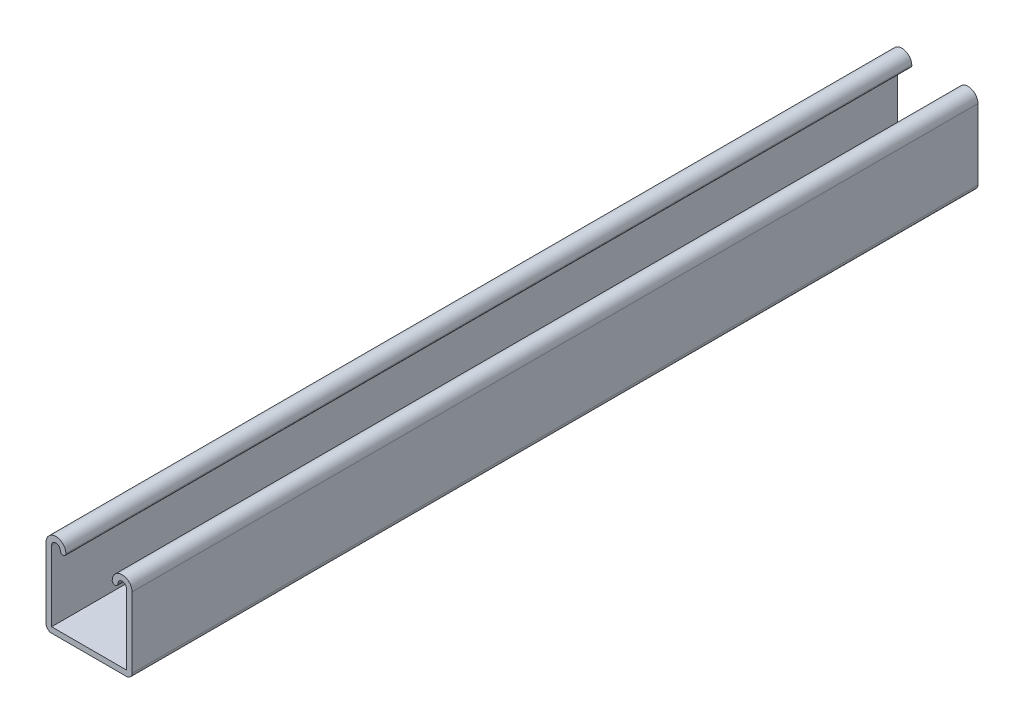
ISO-10303-21;
HEADER;
FILE_DESCRIPTION(('STEP AP214'),'2;1');
FILE_NAME('part.step','',(''),(''),'','','');
FILE_SCHEMA(('AUTOMOTIVE_DESIGN { 1 0 10303 214 1 1 1 1 }'));
ENDSEC;
DATA;
#1=APPLICATION_CONTEXT('core data for automotive mechanical design processes');
#2=APPLICATION_PROTOCOL_DEFINITION('international standard','automotive_design',2000,#1);
#3=PRODUCT_CONTEXT('',#1,'mechanical');
#4=PRODUCT('Part','Part','',(#3));
#5=PRODUCT_RELATED_PRODUCT_CATEGORY('part','',(#4));
#6=PRODUCT_DEFINITION_FORMATION('','',#4);
#7=PRODUCT_DEFINITION_CONTEXT('part definition',#1,'design');
#8=PRODUCT_DEFINITION('design','',#6,#7);
#9=PRODUCT_DEFINITION_SHAPE('','',#8);
#10=(LENGTH_UNIT() NAMED_UNIT(*) SI_UNIT(.MILLI.,.METRE.));
#11=(NAMED_UNIT(*) PLANE_ANGLE_UNIT() SI_UNIT($,.RADIAN.));
#12=(NAMED_UNIT(*) SI_UNIT($,.STERADIAN.) SOLID_ANGLE_UNIT());
#13=UNCERTAINTY_MEASURE_WITH_UNIT(LENGTH_MEASURE(1.E-05),#10,'distance_accuracy_value','');
#14=(GEOMETRIC_REPRESENTATION_CONTEXT(3) GLOBAL_UNCERTAINTY_ASSIGNED_CONTEXT((#13)) GLOBAL_UNIT_ASSIGNED_CONTEXT((#10,
#11,#12)) REPRESENTATION_CONTEXT('',''));
#15=CARTESIAN_POINT('',(0.,0.,0.));
#16=DIRECTION('',(0.,0.,1.));
#17=DIRECTION('',(1.,0.,0.));
#18=AXIS2_PLACEMENT_3D('',#15,#16,#17);
#19=CARTESIAN_POINT('',(0.,2.6924,406.4));
#20=DIRECTION('',(0.,0.,-1.));
#21=DIRECTION('',(-1.,0.,0.));
#22=AXIS2_PLACEMENT_3D('',#19,#20,#21);
#23=CYLINDRICAL_SURFACE('',#22,2.6924);
#24=CARTESIAN_POINT('',(0.,2.6924,0.));
#25=DIRECTION('',(0.,0.,1.));
#26=DIRECTION('',(-1.,0.,0.));
#27=AXIS2_PLACEMENT_3D('',#24,#25,#26);
#28=CIRCLE('',#27,2.6924);
#29=CARTESIAN_POINT('',(-2.6924,2.6924,0.));
#30=VERTEX_POINT('',#29);
#31=CARTESIAN_POINT('',(0.,0.,0.));
#32=VERTEX_POINT('',#31);
#33=EDGE_CURVE('E164',#30,#32,#28,.T.);
#34=ORIENTED_EDGE('',*,*,#33,.T.);
#35=DIRECTION('',(0.,0.,-1.));
#36=VECTOR('',#35,1.);
#37=CARTESIAN_POINT('',(0.,0.,406.4));
#38=LINE('',#37,#36);
#39=CARTESIAN_POINT('',(0.,0.,406.4));
#40=VERTEX_POINT('',#39);
#41=EDGE_CURVE('E11',#40,#32,#38,.T.);
#42=ORIENTED_EDGE('',*,*,#41,.F.);
#43=CARTESIAN_POINT('',(0.,2.6924,406.4));
#44=DIRECTION('',(0.,0.,1.));
#45=DIRECTION('',(-1.,0.,0.));
#46=AXIS2_PLACEMENT_3D('',#43,#44,#45);
#47=CIRCLE('',#46,2.6924);
#48=CARTESIAN_POINT('',(-2.6924,2.6924,406.4));
#49=VERTEX_POINT('',#48);
#50=EDGE_CURVE('E190',#49,#40,#47,.T.);
#51=ORIENTED_EDGE('',*,*,#50,.F.);
#52=DIRECTION('',(0.,0.,-1.));
#53=VECTOR('',#52,1.);
#54=CARTESIAN_POINT('',(-2.6924,2.6924,406.4));
#55=LINE('',#54,#53);
#56=EDGE_CURVE('E160',#49,#30,#55,.T.);
#57=ORIENTED_EDGE('',*,*,#56,.T.);
#58=EDGE_LOOP('',(#34,#42,#51,#57));
#59=FACE_BOUND('',#58,.T.);
#60=ADVANCED_FACE('F32',(#59),#23,.T.);
#61=CARTESIAN_POINT('',(0.,0.,406.4));
#62=DIRECTION('',(0.,1.,0.));
#63=DIRECTION('',(0.,0.,1.));
#64=AXIS2_PLACEMENT_3D('',#61,#62,#63);
#65=PLANE('',#64);
#66=DIRECTION('',(1.,0.,0.));
#67=VECTOR('',#66,1.);
#68=CARTESIAN_POINT('',(0.,0.,0.));
#69=LINE('',#68,#67);
#70=CARTESIAN_POINT('',(35.98,0.,0.));
#71=VERTEX_POINT('',#70);
#72=EDGE_CURVE('E167',#32,#71,#69,.T.);
#73=ORIENTED_EDGE('',*,*,#72,.T.);
#74=DIRECTION('',(0.,0.,-1.));
#75=VECTOR('',#74,1.);
#76=CARTESIAN_POINT('',(35.98,0.,406.4));
#77=LINE('',#76,#75);
#78=CARTESIAN_POINT('',(35.98,0.,406.4));
#79=VERTEX_POINT('',#78);
#80=EDGE_CURVE('E40',#79,#71,#77,.T.);
#81=ORIENTED_EDGE('',*,*,#80,.F.);
#82=DIRECTION('',(1.,0.,0.));
#83=VECTOR('',#82,1.);
#84=CARTESIAN_POINT('',(0.,0.,406.4));
#85=LINE('',#84,#83);
#86=EDGE_CURVE('E109',#40,#79,#85,.T.);
#87=ORIENTED_EDGE('',*,*,#86,.F.);
#88=ORIENTED_EDGE('',*,*,#41,.T.);
#89=EDGE_LOOP('',(#73,#81,#87,#88));
#90=FACE_BOUND('',#89,.T.);
#91=ADVANCED_FACE('F278',(#90),#65,.F.);
#92=CARTESIAN_POINT('',(35.98,2.6924,406.4));
#93=DIRECTION('',(0.,0.,-1.));
#94=DIRECTION('',(-1.,0.,0.));
#95=AXIS2_PLACEMENT_3D('',#92,#93,#94);
#96=CYLINDRICAL_SURFACE('',#95,2.6924);
#97=CARTESIAN_POINT('',(35.98,2.6924,0.));
#98=DIRECTION('',(0.,0.,1.));
#99=DIRECTION('',(1.,0.,0.));
#100=AXIS2_PLACEMENT_3D('',#97,#98,#99);
#101=CIRCLE('',#100,2.6924);
#102=CARTESIAN_POINT('',(38.6724,2.6924,0.));
#103=VERTEX_POINT('',#102);
#104=EDGE_CURVE('E169',#71,#103,#101,.T.);
#105=ORIENTED_EDGE('',*,*,#104,.T.);
#106=DIRECTION('',(0.,0.,-1.));
#107=VECTOR('',#106,1.);
#108=CARTESIAN_POINT('',(38.6724,2.6924,406.4));
#109=LINE('',#108,#107);
#110=CARTESIAN_POINT('',(38.6724,2.6924,406.4));
#111=VERTEX_POINT('',#110);
#112=EDGE_CURVE('E215',#111,#103,#109,.T.);
#113=ORIENTED_EDGE('',*,*,#112,.F.);
#114=CARTESIAN_POINT('',(35.98,2.6924,406.4));
#115=DIRECTION('',(0.,0.,1.));
#116=DIRECTION('',(1.,0.,0.));
#117=AXIS2_PLACEMENT_3D('',#114,#115,#116);
#118=CIRCLE('',#117,2.6924);
#119=EDGE_CURVE('E223',#79,#111,#118,.T.);
#120=ORIENTED_EDGE('',*,*,#119,.F.);
#121=ORIENTED_EDGE('',*,*,#80,.T.);
#122=EDGE_LOOP('',(#105,#113,#120,#121));
#123=FACE_BOUND('',#122,.T.);
#124=ADVANCED_FACE('F221',(#123),#96,.T.);
#125=CARTESIAN_POINT('',(38.6724,2.6924,406.4));
#126=DIRECTION('',(-1.,0.,0.));
#127=DIRECTION('',(0.,0.,1.));
#128=AXIS2_PLACEMENT_3D('',#125,#126,#127);
#129=PLANE('',#128);
#130=DIRECTION('',(0.,1.,0.));
#131=VECTOR('',#130,1.);
#132=CARTESIAN_POINT('',(38.6724,2.6924,0.));
#133=LINE('',#132,#131);
#134=CARTESIAN_POINT('',(38.6724,36.5252,0.));
#135=VERTEX_POINT('',#134);
#136=EDGE_CURVE('E171',#103,#135,#133,.T.);
#137=ORIENTED_EDGE('',*,*,#136,.T.);
#138=DIRECTION('',(0.,0.,-1.));
#139=VECTOR('',#138,1.);
#140=CARTESIAN_POINT('',(38.6724,36.5252,406.4));
#141=LINE('',#140,#139);
#142=CARTESIAN_POINT('',(38.6724,36.5252,406.4));
#143=VERTEX_POINT('',#142);
#144=EDGE_CURVE('E212',#143,#135,#141,.T.);
#145=ORIENTED_EDGE('',*,*,#144,.F.);
#146=DIRECTION('',(0.,1.,0.));
#147=VECTOR('',#146,1.);
#148=CARTESIAN_POINT('',(38.6724,2.6924,406.4));
#149=LINE('',#148,#147);
#150=EDGE_CURVE('E241',#111,#143,#149,.T.);
#151=ORIENTED_EDGE('',*,*,#150,.F.);
#152=ORIENTED_EDGE('',*,*,#112,.T.);
#153=EDGE_LOOP('',(#137,#145,#151,#152));
#154=FACE_BOUND('',#153,.T.);
#155=ADVANCED_FACE('F232',(#154),#129,.F.);
#156=CARTESIAN_POINT('',(33.8972,36.5252,406.4));
#157=DIRECTION('',(0.,0.,-1.));
#158=DIRECTION('',(-1.,0.,0.));
#159=AXIS2_PLACEMENT_3D('',#156,#157,#158);
#160=CYLINDRICAL_SURFACE('',#159,4.7752);
#161=CARTESIAN_POINT('',(33.8972,36.5252,0.));
#162=DIRECTION('',(0.,0.,1.));
#163=DIRECTION('',(1.,0.,0.));
#164=AXIS2_PLACEMENT_3D('',#161,#162,#163);
#165=CIRCLE('',#164,4.7752);
#166=CARTESIAN_POINT('',(29.122,36.5252,0.));
#167=VERTEX_POINT('',#166);
#168=EDGE_CURVE('E173',#135,#167,#165,.T.);
#169=ORIENTED_EDGE('',*,*,#168,.T.);
#170=DIRECTION('',(0.,0.,-1.));
#171=VECTOR('',#170,1.);
#172=CARTESIAN_POINT('',(29.122,36.5252,406.4));
#173=LINE('',#172,#171);
#174=CARTESIAN_POINT('',(29.122,36.5252,406.4));
#175=VERTEX_POINT('',#174);
#176=EDGE_CURVE('E209',#175,#167,#173,.T.);
#177=ORIENTED_EDGE('',*,*,#176,.F.);
#178=CARTESIAN_POINT('',(33.8972,36.5252,406.4));
#179=DIRECTION('',(0.,0.,1.));
#180=DIRECTION('',(1.,0.,0.));
#181=AXIS2_PLACEMENT_3D('',#178,#179,#180);
#182=CIRCLE('',#181,4.7752);
#183=EDGE_CURVE('E238',#143,#175,#182,.T.);
#184=ORIENTED_EDGE('',*,*,#183,.F.);
#185=ORIENTED_EDGE('',*,*,#144,.T.);
#186=EDGE_LOOP('',(#169,#177,#184,#185));
#187=FACE_BOUND('',#186,.T.);
#188=ADVANCED_FACE('F236',(#187),#160,.T.);
#189=CARTESIAN_POINT('',(30.4682,36.5252,406.4));
#190=DIRECTION('',(0.,0.,-1.));
#191=DIRECTION('',(-1.,0.,0.));
#192=AXIS2_PLACEMENT_3D('',#189,#190,#191);
#193=CYLINDRICAL_SURFACE('',#192,1.3462);
#194=CARTESIAN_POINT('',(30.4682,36.5252,0.));
#195=DIRECTION('',(0.,0.,1.));
#196=DIRECTION('',(1.,0.,0.));
#197=AXIS2_PLACEMENT_3D('',#194,#195,#196);
#198=CIRCLE('',#197,1.3462);
#199=CARTESIAN_POINT('',(31.8144,36.5252,0.));
#200=VERTEX_POINT('',#199);
#201=EDGE_CURVE('E175',#167,#200,#198,.T.);
#202=ORIENTED_EDGE('',*,*,#201,.T.);
#203=DIRECTION('',(0.,0.,-1.));
#204=VECTOR('',#203,1.);
#205=CARTESIAN_POINT('',(31.8144,36.5252,406.4));
#206=LINE('',#205,#204);
#207=CARTESIAN_POINT('',(31.8144,36.5252,406.4));
#208=VERTEX_POINT('',#207);
#209=EDGE_CURVE('E206',#208,#200,#206,.T.);
#210=ORIENTED_EDGE('',*,*,#209,.F.);
#211=CARTESIAN_POINT('',(30.4682,36.5252,406.4));
#212=DIRECTION('',(0.,0.,1.));
#213=DIRECTION('',(1.,0.,0.));
#214=AXIS2_PLACEMENT_3D('',#211,#212,#213);
#215=CIRCLE('',#214,1.3462);
#216=EDGE_CURVE('E240',#175,#208,#215,.T.);
#217=ORIENTED_EDGE('',*,*,#216,.F.);
#218=ORIENTED_EDGE('',*,*,#176,.T.);
#219=EDGE_LOOP('',(#202,#210,#217,#218));
#220=FACE_BOUND('',#219,.T.);
#221=ADVANCED_FACE('F291',(#220),#193,.T.);
#222=CARTESIAN_POINT('',(33.8972,36.5252,406.4));
#223=DIRECTION('',(0.,0.,-1.));
#224=DIRECTION('',(-1.,0.,0.));
#225=AXIS2_PLACEMENT_3D('',#222,#223,#224);
#226=CYLINDRICAL_SURFACE('',#225,2.0828);
#227=CARTESIAN_POINT('',(33.8972,36.5252,0.));
#228=DIRECTION('',(0.,0.,-1.));
#229=DIRECTION('',(1.,0.,0.));
#230=AXIS2_PLACEMENT_3D('',#227,#228,#229);
#231=CIRCLE('',#230,2.0828);
#232=CARTESIAN_POINT('',(35.98,36.5252,0.));
#233=VERTEX_POINT('',#232);
#234=EDGE_CURVE('E177',#200,#233,#231,.T.);
#235=ORIENTED_EDGE('',*,*,#234,.T.);
#236=DIRECTION('',(0.,0.,-1.));
#237=VECTOR('',#236,1.);
#238=CARTESIAN_POINT('',(35.98,36.5252,406.4));
#239=LINE('',#238,#237);
#240=CARTESIAN_POINT('',(35.98,36.5252,406.4));
#241=VERTEX_POINT('',#240);
#242=EDGE_CURVE('E203',#241,#233,#239,.T.);
#243=ORIENTED_EDGE('',*,*,#242,.F.);
#244=CARTESIAN_POINT('',(33.8972,36.5252,406.4));
#245=DIRECTION('',(0.,0.,-1.));
#246=DIRECTION('',(1.,0.,0.));
#247=AXIS2_PLACEMENT_3D('',#244,#245,#246);
#248=CIRCLE('',#247,2.0828);
#249=EDGE_CURVE('E243',#208,#241,#248,.T.);
#250=ORIENTED_EDGE('',*,*,#249,.F.);
#251=ORIENTED_EDGE('',*,*,#209,.T.);
#252=EDGE_LOOP('',(#235,#243,#250,#251));
#253=FACE_BOUND('',#252,.T.);
#254=ADVANCED_FACE('F294',(#253),#226,.F.);
#255=CARTESIAN_POINT('',(35.98,2.6924,406.4));
#256=DIRECTION('',(1.,0.,0.));
#257=DIRECTION('',(0.,0.,-1.));
#258=AXIS2_PLACEMENT_3D('',#255,#256,#257);
#259=PLANE('',#258);
#260=DIRECTION('',(0.,-1.,0.));
#261=VECTOR('',#260,1.);
#262=CARTESIAN_POINT('',(35.98,2.6924,0.));
#263=LINE('',#262,#261);
#264=CARTESIAN_POINT('',(35.98,2.6924,0.));
#265=VERTEX_POINT('',#264);
#266=EDGE_CURVE('E179',#233,#265,#263,.T.);
#267=ORIENTED_EDGE('',*,*,#266,.T.);
#268=DIRECTION('',(0.,0.,-1.));
#269=VECTOR('',#268,1.);
#270=CARTESIAN_POINT('',(35.98,2.6924,406.4));
#271=LINE('',#270,#269);
#272=CARTESIAN_POINT('',(35.98,2.6924,406.4));
#273=VERTEX_POINT('',#272);
#274=EDGE_CURVE('E200',#273,#265,#271,.T.);
#275=ORIENTED_EDGE('',*,*,#274,.F.);
#276=DIRECTION('',(0.,-1.,0.));
#277=VECTOR('',#276,1.);
#278=CARTESIAN_POINT('',(35.98,2.6924,406.4));
#279=LINE('',#278,#277);
#280=EDGE_CURVE('E249',#241,#273,#279,.T.);
#281=ORIENTED_EDGE('',*,*,#280,.F.);
#282=ORIENTED_EDGE('',*,*,#242,.T.);
#283=EDGE_LOOP('',(#267,#275,#281,#282));
#284=FACE_BOUND('',#283,.T.);
#285=ADVANCED_FACE('F298',(#284),#259,.F.);
#286=CARTESIAN_POINT('',(35.98,2.6924,406.4));
#287=DIRECTION('',(0.,-1.,0.));
#288=DIRECTION('',(0.,0.,-1.));
#289=AXIS2_PLACEMENT_3D('',#286,#287,#288);
#290=PLANE('',#289);
#291=DIRECTION('',(-1.,0.,0.));
#292=VECTOR('',#291,1.);
#293=CARTESIAN_POINT('',(35.98,2.6924,0.));
#294=LINE('',#293,#292);
#295=CARTESIAN_POINT('',(0.,2.6924,0.));
#296=VERTEX_POINT('',#295);
#297=EDGE_CURVE('E181',#265,#296,#294,.T.);
#298=ORIENTED_EDGE('',*,*,#297,.T.);
#299=DIRECTION('',(0.,0.,-1.));
#300=VECTOR('',#299,1.);
#301=CARTESIAN_POINT('',(0.,2.6924,406.4));
#302=LINE('',#301,#300);
#303=CARTESIAN_POINT('',(0.,2.6924,406.4));
#304=VERTEX_POINT('',#303);
#305=EDGE_CURVE('E197',#304,#296,#302,.T.);
#306=ORIENTED_EDGE('',*,*,#305,.F.);
#307=DIRECTION('',(-1.,0.,0.));
#308=VECTOR('',#307,1.);
#309=CARTESIAN_POINT('',(35.98,2.6924,406.4));
#310=LINE('',#309,#308);
#311=EDGE_CURVE('E251',#273,#304,#310,.T.);
#312=ORIENTED_EDGE('',*,*,#311,.F.);
#313=ORIENTED_EDGE('',*,*,#274,.T.);
#314=EDGE_LOOP('',(#298,#306,#312,#313));
#315=FACE_BOUND('',#314,.T.);
#316=ADVANCED_FACE('F302',(#315),#290,.F.);
#317=CARTESIAN_POINT('',(0.,2.6924,406.4));
#318=DIRECTION('',(-1.,0.,0.));
#319=DIRECTION('',(0.,0.,1.));
#320=AXIS2_PLACEMENT_3D('',#317,#318,#319);
#321=PLANE('',#320);
#322=DIRECTION('',(0.,1.,0.));
#323=VECTOR('',#322,1.);
#324=CARTESIAN_POINT('',(0.,2.6924,0.));
#325=LINE('',#324,#323);
#326=CARTESIAN_POINT('',(0.,36.5252,0.));
#327=VERTEX_POINT('',#326);
#328=EDGE_CURVE('E183',#296,#327,#325,.T.);
#329=ORIENTED_EDGE('',*,*,#328,.T.);
#330=DIRECTION('',(0.,0.,-1.));
#331=VECTOR('',#330,1.);
#332=CARTESIAN_POINT('',(0.,36.5252,406.4));
#333=LINE('',#332,#331);
#334=CARTESIAN_POINT('',(0.,36.5252,406.4));
#335=VERTEX_POINT('',#334);
#336=EDGE_CURVE('E194',#335,#327,#333,.T.);
#337=ORIENTED_EDGE('',*,*,#336,.F.);
#338=DIRECTION('',(0.,1.,0.));
#339=VECTOR('',#338,1.);
#340=CARTESIAN_POINT('',(0.,2.6924,406.4));
#341=LINE('',#340,#339);
#342=EDGE_CURVE('E253',#304,#335,#341,.T.);
#343=ORIENTED_EDGE('',*,*,#342,.F.);
#344=ORIENTED_EDGE('',*,*,#305,.T.);
#345=EDGE_LOOP('',(#329,#337,#343,#344));
#346=FACE_BOUND('',#345,.T.);
#347=ADVANCED_FACE('F259',(#346),#321,.F.);
#348=CARTESIAN_POINT('',(2.0828,36.5252,406.4));
#349=DIRECTION('',(0.,0.,-1.));
#350=DIRECTION('',(-1.,0.,0.));
#351=AXIS2_PLACEMENT_3D('',#348,#349,#350);
#352=CYLINDRICAL_SURFACE('',#351,2.0828);
#353=CARTESIAN_POINT('',(2.0828,36.5252,0.));
#354=DIRECTION('',(0.,0.,-1.));
#355=DIRECTION('',(-1.,0.,0.));
#356=AXIS2_PLACEMENT_3D('',#353,#354,#355);
#357=CIRCLE('',#356,2.0828);
#358=CARTESIAN_POINT('',(4.16560000000001,36.5252,0.));
#359=VERTEX_POINT('',#358);
#360=EDGE_CURVE('E185',#327,#359,#357,.T.);
#361=ORIENTED_EDGE('',*,*,#360,.T.);
#362=DIRECTION('',(0.,0.,-1.));
#363=VECTOR('',#362,1.);
#364=CARTESIAN_POINT('',(4.16560000000001,36.5252,406.4));
#365=LINE('',#364,#363);
#366=CARTESIAN_POINT('',(4.16560000000001,36.5252,406.4));
#367=VERTEX_POINT('',#366);
#368=EDGE_CURVE('E155',#367,#359,#365,.T.);
#369=ORIENTED_EDGE('',*,*,#368,.F.);
#370=CARTESIAN_POINT('',(2.0828,36.5252,406.4));
#371=DIRECTION('',(0.,0.,-1.));
#372=DIRECTION('',(-1.,0.,0.));
#373=AXIS2_PLACEMENT_3D('',#370,#371,#372);
#374=CIRCLE('',#373,2.0828);
#375=EDGE_CURVE('E146',#335,#367,#374,.T.);
#376=ORIENTED_EDGE('',*,*,#375,.F.);
#377=ORIENTED_EDGE('',*,*,#336,.T.);
#378=EDGE_LOOP('',(#361,#369,#376,#377));
#379=FACE_BOUND('',#378,.T.);
#380=ADVANCED_FACE('F263',(#379),#352,.F.);
#381=CARTESIAN_POINT('',(5.5118,36.5252,406.4));
#382=DIRECTION('',(0.,0.,-1.));
#383=DIRECTION('',(-1.,0.,0.));
#384=AXIS2_PLACEMENT_3D('',#381,#382,#383);
#385=CYLINDRICAL_SURFACE('',#384,1.3462);
#386=CARTESIAN_POINT('',(5.5118,36.5252,0.));
#387=DIRECTION('',(0.,0.,1.));
#388=DIRECTION('',(-1.,0.,0.));
#389=AXIS2_PLACEMENT_3D('',#386,#387,#388);
#390=CIRCLE('',#389,1.3462);
#391=CARTESIAN_POINT('',(6.858,36.5252,0.));
#392=VERTEX_POINT('',#391);
#393=EDGE_CURVE('E154',#359,#392,#390,.T.);
#394=ORIENTED_EDGE('',*,*,#393,.T.);
#395=DIRECTION('',(0.,0.,-1.));
#396=VECTOR('',#395,1.);
#397=CARTESIAN_POINT('',(6.858,36.5252,406.4));
#398=LINE('',#397,#396);
#399=CARTESIAN_POINT('',(6.858,36.5252,406.4));
#400=VERTEX_POINT('',#399);
#401=EDGE_CURVE('E151',#400,#392,#398,.T.);
#402=ORIENTED_EDGE('',*,*,#401,.F.);
#403=CARTESIAN_POINT('',(5.5118,36.5252,406.4));
#404=DIRECTION('',(0.,0.,1.));
#405=DIRECTION('',(-1.,0.,0.));
#406=AXIS2_PLACEMENT_3D('',#403,#404,#405);
#407=CIRCLE('',#406,1.3462);
#408=EDGE_CURVE('E140',#367,#400,#407,.T.);
#409=ORIENTED_EDGE('',*,*,#408,.F.);
#410=ORIENTED_EDGE('',*,*,#368,.T.);
#411=EDGE_LOOP('',(#394,#402,#409,#410));
#412=FACE_BOUND('',#411,.T.);
#413=ADVANCED_FACE('F152',(#412),#385,.T.);
#414=CARTESIAN_POINT('',(2.0828,36.5252,406.4));
#415=DIRECTION('',(0.,0.,-1.));
#416=DIRECTION('',(-1.,0.,0.));
#417=AXIS2_PLACEMENT_3D('',#414,#415,#416);
#418=CYLINDRICAL_SURFACE('',#417,4.7752);
#419=CARTESIAN_POINT('',(2.0828,36.5252,0.));
#420=DIRECTION('',(0.,0.,1.));
#421=DIRECTION('',(-1.,0.,0.));
#422=AXIS2_PLACEMENT_3D('',#419,#420,#421);
#423=CIRCLE('',#422,4.7752);
#424=CARTESIAN_POINT('',(-2.6924,36.5252,0.));
#425=VERTEX_POINT('',#424);
#426=EDGE_CURVE('E95',#392,#425,#423,.T.);
#427=ORIENTED_EDGE('',*,*,#426,.T.);
#428=DIRECTION('',(0.,0.,-1.));
#429=VECTOR('',#428,1.);
#430=CARTESIAN_POINT('',(-2.6924,36.5252,406.4));
#431=LINE('',#430,#429);
#432=CARTESIAN_POINT('',(-2.6924,36.5252,406.4));
#433=VERTEX_POINT('',#432);
#434=EDGE_CURVE('E156',#433,#425,#431,.T.);
#435=ORIENTED_EDGE('',*,*,#434,.F.);
#436=CARTESIAN_POINT('',(2.0828,36.5252,406.4));
#437=DIRECTION('',(0.,0.,1.));
#438=DIRECTION('',(-1.,0.,0.));
#439=AXIS2_PLACEMENT_3D('',#436,#437,#438);
#440=CIRCLE('',#439,4.7752);
#441=EDGE_CURVE('E144',#400,#433,#440,.T.);
#442=ORIENTED_EDGE('',*,*,#441,.F.);
#443=ORIENTED_EDGE('',*,*,#401,.T.);
#444=EDGE_LOOP('',(#427,#435,#442,#443));
#445=FACE_BOUND('',#444,.T.);
#446=ADVANCED_FACE('F158',(#445),#418,.T.);
#447=CARTESIAN_POINT('',(-2.6924,2.6924,406.4));
#448=DIRECTION('',(1.,0.,0.));
#449=DIRECTION('',(0.,0.,-1.));
#450=AXIS2_PLACEMENT_3D('',#447,#448,#449);
#451=PLANE('',#450);
#452=DIRECTION('',(0.,-1.,0.));
#453=VECTOR('',#452,1.);
#454=CARTESIAN_POINT('',(-2.6924,2.6924,0.));
#455=LINE('',#454,#453);
#456=EDGE_CURVE('E101',#425,#30,#455,.T.);
#457=ORIENTED_EDGE('',*,*,#456,.T.);
#458=ORIENTED_EDGE('',*,*,#56,.F.);
#459=DIRECTION('',(0.,-1.,0.));
#460=VECTOR('',#459,1.);
#461=CARTESIAN_POINT('',(-2.6924,2.6924,406.4));
#462=LINE('',#461,#460);
#463=EDGE_CURVE('E48',#433,#49,#462,.T.);
#464=ORIENTED_EDGE('',*,*,#463,.F.);
#465=ORIENTED_EDGE('',*,*,#434,.T.);
#466=EDGE_LOOP('',(#457,#458,#464,#465));
#467=FACE_BOUND('',#466,.T.);
#468=ADVANCED_FACE('F267',(#467),#451,.F.);
#469=CARTESIAN_POINT('',(0.,2.6924,406.4));
#470=DIRECTION('',(0.,0.,-1.));
#471=DIRECTION('',(-1.,0.,0.));
#472=AXIS2_PLACEMENT_3D('',#469,#470,#471);
#473=PLANE('',#472);
#474=ORIENTED_EDGE('',*,*,#50,.T.);
#475=ORIENTED_EDGE('',*,*,#86,.T.);
#476=ORIENTED_EDGE('',*,*,#119,.T.);
#477=ORIENTED_EDGE('',*,*,#150,.T.);
#478=ORIENTED_EDGE('',*,*,#183,.T.);
#479=ORIENTED_EDGE('',*,*,#216,.T.);
#480=ORIENTED_EDGE('',*,*,#249,.T.);
#481=ORIENTED_EDGE('',*,*,#280,.T.);
#482=ORIENTED_EDGE('',*,*,#311,.T.);
#483=ORIENTED_EDGE('',*,*,#342,.T.);
#484=ORIENTED_EDGE('',*,*,#375,.T.);
#485=ORIENTED_EDGE('',*,*,#408,.T.);
#486=ORIENTED_EDGE('',*,*,#441,.T.);
#487=ORIENTED_EDGE('',*,*,#463,.T.);
#488=EDGE_LOOP('',(#474,#475,#476,#477,#478,#479,#480,#481,#482,#483,#484,#485,#486,#487));
#489=FACE_BOUND('',#488,.T.);
#490=ADVANCED_FACE('F142',(#489),#473,.F.);
#491=CARTESIAN_POINT('',(0.,2.6924,0.));
#492=DIRECTION('',(0.,0.,-1.));
#493=DIRECTION('',(-1.,0.,0.));
#494=AXIS2_PLACEMENT_3D('',#491,#492,#493);
#495=PLANE('',#494);
#496=ORIENTED_EDGE('',*,*,#33,.F.);
#497=ORIENTED_EDGE('',*,*,#456,.F.);
#498=ORIENTED_EDGE('',*,*,#426,.F.);
#499=ORIENTED_EDGE('',*,*,#393,.F.);
#500=ORIENTED_EDGE('',*,*,#360,.F.);
#501=ORIENTED_EDGE('',*,*,#328,.F.);
#502=ORIENTED_EDGE('',*,*,#297,.F.);
#503=ORIENTED_EDGE('',*,*,#266,.F.);
#504=ORIENTED_EDGE('',*,*,#234,.F.);
#505=ORIENTED_EDGE('',*,*,#201,.F.);
#506=ORIENTED_EDGE('',*,*,#168,.F.);
#507=ORIENTED_EDGE('',*,*,#136,.F.);
#508=ORIENTED_EDGE('',*,*,#104,.F.);
#509=ORIENTED_EDGE('',*,*,#72,.F.);
#510=EDGE_LOOP('',(#496,#497,#498,#499,#500,#501,#502,#503,#504,#505,#506,#507,#508,#509));
#511=FACE_BOUND('',#510,.T.);
#512=ADVANCED_FACE('F227',(#511),#495,.T.);
#513=CLOSED_SHELL('',(#60,#91,#124,#155,#188,#221,#254,#285,#316,#347,#380,#413,#446,#468,#490,#512));
#514=MANIFOLD_SOLID_BREP('B2',#513);
#515=ADVANCED_BREP_SHAPE_REPRESENTATION('',(#18,#514),#14);
#516=SHAPE_DEFINITION_REPRESENTATION(#9,#515);
ENDSEC;
END-ISO-10303-21;
